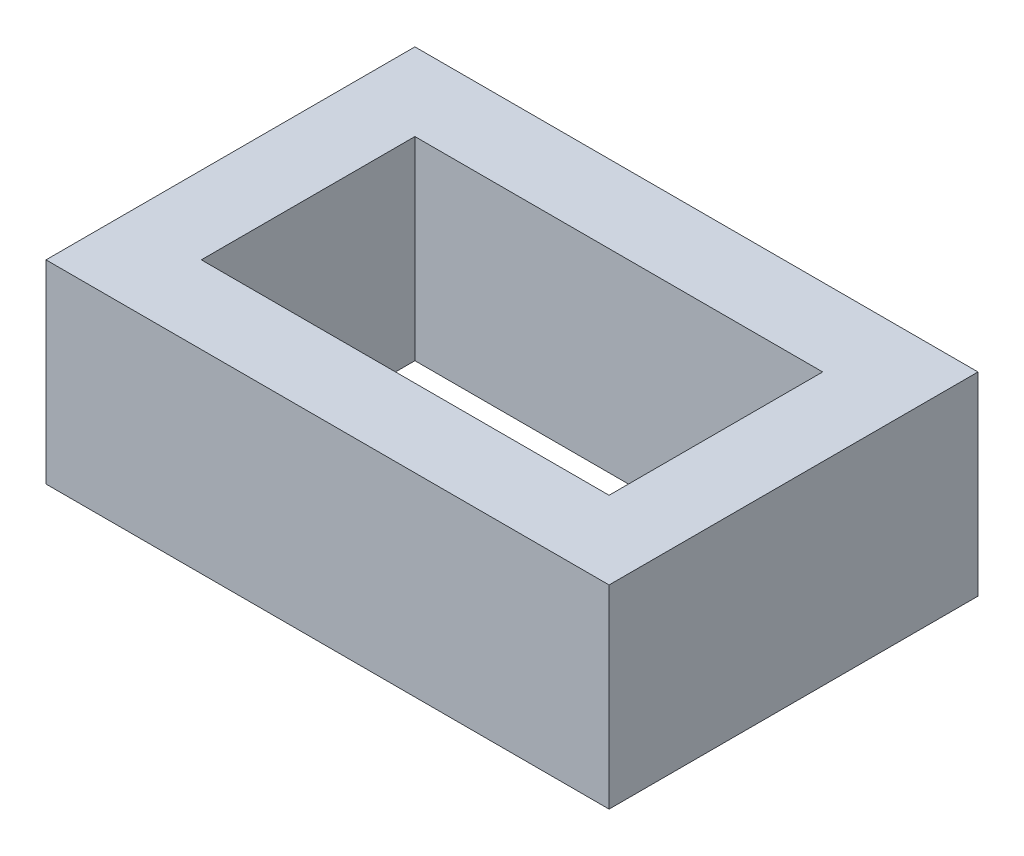
ISO-10303-21;
HEADER;
FILE_DESCRIPTION(('STEP AP214'),'2;1');
FILE_NAME('part.step','',(''),(''),'','','');
FILE_SCHEMA(('AUTOMOTIVE_DESIGN { 1 0 10303 214 1 1 1 1 }'));
ENDSEC;
DATA;
#1=APPLICATION_CONTEXT('core data for automotive mechanical design processes');
#2=APPLICATION_PROTOCOL_DEFINITION('international standard','automotive_design',2000,#1);
#3=PRODUCT_CONTEXT('',#1,'mechanical');
#4=PRODUCT('Part','Part','',(#3));
#5=PRODUCT_RELATED_PRODUCT_CATEGORY('part','',(#4));
#6=PRODUCT_DEFINITION_FORMATION('','',#4);
#7=PRODUCT_DEFINITION_CONTEXT('part definition',#1,'design');
#8=PRODUCT_DEFINITION('design','',#6,#7);
#9=PRODUCT_DEFINITION_SHAPE('','',#8);
#10=(LENGTH_UNIT() NAMED_UNIT(*) SI_UNIT(.MILLI.,.METRE.));
#11=(NAMED_UNIT(*) PLANE_ANGLE_UNIT() SI_UNIT($,.RADIAN.));
#12=(NAMED_UNIT(*) SI_UNIT($,.STERADIAN.) SOLID_ANGLE_UNIT());
#13=UNCERTAINTY_MEASURE_WITH_UNIT(LENGTH_MEASURE(1.E-05),#10,'distance_accuracy_value','');
#14=(GEOMETRIC_REPRESENTATION_CONTEXT(3) GLOBAL_UNCERTAINTY_ASSIGNED_CONTEXT((#13)) GLOBAL_UNIT_ASSIGNED_CONTEXT((#10,
#11,#12)) REPRESENTATION_CONTEXT('',''));
#15=CARTESIAN_POINT('',(0.,0.,0.));
#16=DIRECTION('',(0.,0.,1.));
#17=DIRECTION('',(1.,0.,0.));
#18=AXIS2_PLACEMENT_3D('',#15,#16,#17);
#19=CARTESIAN_POINT('',(0.,5.,0.));
#20=DIRECTION('',(0.,-1.,0.));
#21=DIRECTION('',(0.,0.,-1.));
#22=AXIS2_PLACEMENT_3D('',#19,#20,#21);
#23=PLANE('',#22);
#24=DIRECTION('',(-1.,0.,0.));
#25=VECTOR('',#24,1.);
#26=CARTESIAN_POINT('',(-7.25000000000001,5.,-4.75));
#27=LINE('',#26,#25);
#28=CARTESIAN_POINT('',(7.25,5.,-4.75));
#29=VERTEX_POINT('',#28);
#30=CARTESIAN_POINT('',(-7.25000000000001,5.,-4.75));
#31=VERTEX_POINT('',#30);
#32=EDGE_CURVE('E134',#29,#31,#27,.T.);
#33=ORIENTED_EDGE('',*,*,#32,.T.);
#34=DIRECTION('',(0.,0.,1.));
#35=VECTOR('',#34,1.);
#36=CARTESIAN_POINT('',(-7.25000000000001,5.,-4.75));
#37=LINE('',#36,#35);
#38=CARTESIAN_POINT('',(-7.25000000000001,5.,4.75));
#39=VERTEX_POINT('',#38);
#40=EDGE_CURVE('E137',#31,#39,#37,.T.);
#41=ORIENTED_EDGE('',*,*,#40,.T.);
#42=DIRECTION('',(1.,0.,0.));
#43=VECTOR('',#42,1.);
#44=CARTESIAN_POINT('',(-7.25000000000001,5.,4.75));
#45=LINE('',#44,#43);
#46=CARTESIAN_POINT('',(7.25,5.,4.75));
#47=VERTEX_POINT('',#46);
#48=EDGE_CURVE('E140',#39,#47,#45,.T.);
#49=ORIENTED_EDGE('',*,*,#48,.T.);
#50=DIRECTION('',(0.,0.,-1.));
#51=VECTOR('',#50,1.);
#52=CARTESIAN_POINT('',(7.25,5.,-4.75));
#53=LINE('',#52,#51);
#54=EDGE_CURVE('E142',#47,#29,#53,.T.);
#55=ORIENTED_EDGE('',*,*,#54,.T.);
#56=EDGE_LOOP('',(#33,#41,#49,#55));
#57=FACE_BOUND('',#56,.T.);
#58=DIRECTION('',(0.,0.,-1.));
#59=VECTOR('',#58,1.);
#60=CARTESIAN_POINT('',(5.25,5.,-2.75));
#61=LINE('',#60,#59);
#62=CARTESIAN_POINT('',(5.25,5.,2.75));
#63=VERTEX_POINT('',#62);
#64=CARTESIAN_POINT('',(5.25,5.,-2.75));
#65=VERTEX_POINT('',#64);
#66=EDGE_CURVE('E98',#63,#65,#61,.T.);
#67=ORIENTED_EDGE('',*,*,#66,.F.);
#68=DIRECTION('',(1.,0.,0.));
#69=VECTOR('',#68,1.);
#70=CARTESIAN_POINT('',(-5.25,5.,2.75));
#71=LINE('',#70,#69);
#72=CARTESIAN_POINT('',(-5.25,5.,2.75));
#73=VERTEX_POINT('',#72);
#74=EDGE_CURVE('E120',#73,#63,#71,.T.);
#75=ORIENTED_EDGE('',*,*,#74,.F.);
#76=DIRECTION('',(0.,0.,1.));
#77=VECTOR('',#76,1.);
#78=CARTESIAN_POINT('',(-5.25000000000001,5.,-2.75));
#79=LINE('',#78,#77);
#80=CARTESIAN_POINT('',(-5.25000000000001,5.,-2.75));
#81=VERTEX_POINT('',#80);
#82=EDGE_CURVE('E118',#81,#73,#79,.T.);
#83=ORIENTED_EDGE('',*,*,#82,.F.);
#84=DIRECTION('',(-1.,0.,0.));
#85=VECTOR('',#84,1.);
#86=CARTESIAN_POINT('',(-5.25000000000001,5.,-2.75));
#87=LINE('',#86,#85);
#88=EDGE_CURVE('E106',#65,#81,#87,.T.);
#89=ORIENTED_EDGE('',*,*,#88,.F.);
#90=EDGE_LOOP('',(#67,#75,#83,#89));
#91=FACE_BOUND('',#90,.T.);
#92=ADVANCED_FACE('F33',(#57,#91),#23,.F.);
#93=CARTESIAN_POINT('',(0.,0.,0.));
#94=DIRECTION('',(0.,-1.,0.));
#95=DIRECTION('',(0.,0.,-1.));
#96=AXIS2_PLACEMENT_3D('',#93,#94,#95);
#97=PLANE('',#96);
#98=DIRECTION('',(-1.,0.,0.));
#99=VECTOR('',#98,1.);
#100=CARTESIAN_POINT('',(-7.25000000000001,0.,-4.75));
#101=LINE('',#100,#99);
#102=CARTESIAN_POINT('',(7.25,0.,-4.75));
#103=VERTEX_POINT('',#102);
#104=CARTESIAN_POINT('',(-7.25000000000001,0.,-4.75));
#105=VERTEX_POINT('',#104);
#106=EDGE_CURVE('E114',#103,#105,#101,.T.);
#107=ORIENTED_EDGE('',*,*,#106,.F.);
#108=DIRECTION('',(0.,0.,-1.));
#109=VECTOR('',#108,1.);
#110=CARTESIAN_POINT('',(7.25,0.,-4.75));
#111=LINE('',#110,#109);
#112=CARTESIAN_POINT('',(7.25,0.,4.75));
#113=VERTEX_POINT('',#112);
#114=EDGE_CURVE('E138',#113,#103,#111,.T.);
#115=ORIENTED_EDGE('',*,*,#114,.F.);
#116=DIRECTION('',(1.,0.,0.));
#117=VECTOR('',#116,1.);
#118=CARTESIAN_POINT('',(-7.25000000000001,0.,4.75));
#119=LINE('',#118,#117);
#120=CARTESIAN_POINT('',(-7.25000000000001,0.,4.75));
#121=VERTEX_POINT('',#120);
#122=EDGE_CURVE('E149',#121,#113,#119,.T.);
#123=ORIENTED_EDGE('',*,*,#122,.F.);
#124=DIRECTION('',(0.,0.,1.));
#125=VECTOR('',#124,1.);
#126=CARTESIAN_POINT('',(-7.25000000000001,0.,-4.75));
#127=LINE('',#126,#125);
#128=EDGE_CURVE('E147',#105,#121,#127,.T.);
#129=ORIENTED_EDGE('',*,*,#128,.F.);
#130=EDGE_LOOP('',(#107,#115,#123,#129));
#131=FACE_BOUND('',#130,.T.);
#132=DIRECTION('',(1.,0.,0.));
#133=VECTOR('',#132,1.);
#134=CARTESIAN_POINT('',(-5.25,0.,2.75));
#135=LINE('',#134,#133);
#136=CARTESIAN_POINT('',(-5.25,0.,2.75));
#137=VERTEX_POINT('',#136);
#138=CARTESIAN_POINT('',(5.25,0.,2.75));
#139=VERTEX_POINT('',#138);
#140=EDGE_CURVE('E107',#137,#139,#135,.T.);
#141=ORIENTED_EDGE('',*,*,#140,.T.);
#142=DIRECTION('',(0.,0.,-1.));
#143=VECTOR('',#142,1.);
#144=CARTESIAN_POINT('',(5.25,0.,-2.75));
#145=LINE('',#144,#143);
#146=CARTESIAN_POINT('',(5.25,0.,-2.75));
#147=VERTEX_POINT('',#146);
#148=EDGE_CURVE('E56',#139,#147,#145,.T.);
#149=ORIENTED_EDGE('',*,*,#148,.T.);
#150=DIRECTION('',(-1.,0.,0.));
#151=VECTOR('',#150,1.);
#152=CARTESIAN_POINT('',(-5.25000000000001,0.,-2.75));
#153=LINE('',#152,#151);
#154=CARTESIAN_POINT('',(-5.25000000000001,0.,-2.75));
#155=VERTEX_POINT('',#154);
#156=EDGE_CURVE('E113',#147,#155,#153,.T.);
#157=ORIENTED_EDGE('',*,*,#156,.T.);
#158=DIRECTION('',(0.,0.,1.));
#159=VECTOR('',#158,1.);
#160=CARTESIAN_POINT('',(-5.25000000000001,0.,-2.75));
#161=LINE('',#160,#159);
#162=EDGE_CURVE('E126',#155,#137,#161,.T.);
#163=ORIENTED_EDGE('',*,*,#162,.T.);
#164=EDGE_LOOP('',(#141,#149,#157,#163));
#165=FACE_BOUND('',#164,.T.);
#166=ADVANCED_FACE('F167',(#131,#165),#97,.T.);
#167=CARTESIAN_POINT('',(-7.25000000000001,5.,-4.75));
#168=DIRECTION('',(0.,0.,1.));
#169=DIRECTION('',(1.,0.,0.));
#170=AXIS2_PLACEMENT_3D('',#167,#168,#169);
#171=PLANE('',#170);
#172=ORIENTED_EDGE('',*,*,#106,.T.);
#173=DIRECTION('',(0.,-1.,0.));
#174=VECTOR('',#173,1.);
#175=CARTESIAN_POINT('',(-7.25000000000001,5.,-4.75));
#176=LINE('',#175,#174);
#177=EDGE_CURVE('E11',#31,#105,#176,.T.);
#178=ORIENTED_EDGE('',*,*,#177,.F.);
#179=ORIENTED_EDGE('',*,*,#32,.F.);
#180=DIRECTION('',(0.,-1.,0.));
#181=VECTOR('',#180,1.);
#182=CARTESIAN_POINT('',(7.25,5.,-4.75));
#183=LINE('',#182,#181);
#184=EDGE_CURVE('E144',#29,#103,#183,.T.);
#185=ORIENTED_EDGE('',*,*,#184,.T.);
#186=EDGE_LOOP('',(#172,#178,#179,#185));
#187=FACE_BOUND('',#186,.T.);
#188=ADVANCED_FACE('F35',(#187),#171,.F.);
#189=CARTESIAN_POINT('',(-7.25000000000001,5.,-4.75));
#190=DIRECTION('',(1.,0.,0.));
#191=DIRECTION('',(0.,0.,-1.));
#192=AXIS2_PLACEMENT_3D('',#189,#190,#191);
#193=PLANE('',#192);
#194=ORIENTED_EDGE('',*,*,#128,.T.);
#195=DIRECTION('',(0.,-1.,0.));
#196=VECTOR('',#195,1.);
#197=CARTESIAN_POINT('',(-7.25000000000001,5.,4.75));
#198=LINE('',#197,#196);
#199=EDGE_CURVE('E41',#39,#121,#198,.T.);
#200=ORIENTED_EDGE('',*,*,#199,.F.);
#201=ORIENTED_EDGE('',*,*,#40,.F.);
#202=ORIENTED_EDGE('',*,*,#177,.T.);
#203=EDGE_LOOP('',(#194,#200,#201,#202));
#204=FACE_BOUND('',#203,.T.);
#205=ADVANCED_FACE('F177',(#204),#193,.F.);
#206=CARTESIAN_POINT('',(-7.25000000000001,5.,4.75));
#207=DIRECTION('',(0.,0.,-1.));
#208=DIRECTION('',(-1.,0.,0.));
#209=AXIS2_PLACEMENT_3D('',#206,#207,#208);
#210=PLANE('',#209);
#211=ORIENTED_EDGE('',*,*,#122,.T.);
#212=DIRECTION('',(0.,-1.,0.));
#213=VECTOR('',#212,1.);
#214=CARTESIAN_POINT('',(7.25,5.,4.75));
#215=LINE('',#214,#213);
#216=EDGE_CURVE('E154',#47,#113,#215,.T.);
#217=ORIENTED_EDGE('',*,*,#216,.F.);
#218=ORIENTED_EDGE('',*,*,#48,.F.);
#219=ORIENTED_EDGE('',*,*,#199,.T.);
#220=EDGE_LOOP('',(#211,#217,#218,#219));
#221=FACE_BOUND('',#220,.T.);
#222=ADVANCED_FACE('F161',(#221),#210,.F.);
#223=CARTESIAN_POINT('',(7.25,5.,-4.75));
#224=DIRECTION('',(-1.,0.,0.));
#225=DIRECTION('',(0.,0.,1.));
#226=AXIS2_PLACEMENT_3D('',#223,#224,#225);
#227=PLANE('',#226);
#228=ORIENTED_EDGE('',*,*,#114,.T.);
#229=ORIENTED_EDGE('',*,*,#184,.F.);
#230=ORIENTED_EDGE('',*,*,#54,.F.);
#231=ORIENTED_EDGE('',*,*,#216,.T.);
#232=EDGE_LOOP('',(#228,#229,#230,#231));
#233=FACE_BOUND('',#232,.T.);
#234=ADVANCED_FACE('F171',(#233),#227,.F.);
#235=CARTESIAN_POINT('',(5.25,5.,-2.75));
#236=DIRECTION('',(-1.,0.,0.));
#237=DIRECTION('',(0.,0.,1.));
#238=AXIS2_PLACEMENT_3D('',#235,#236,#237);
#239=PLANE('',#238);
#240=ORIENTED_EDGE('',*,*,#148,.F.);
#241=DIRECTION('',(0.,-1.,0.));
#242=VECTOR('',#241,1.);
#243=CARTESIAN_POINT('',(5.25,5.,2.75));
#244=LINE('',#243,#242);
#245=EDGE_CURVE('E102',#63,#139,#244,.T.);
#246=ORIENTED_EDGE('',*,*,#245,.F.);
#247=ORIENTED_EDGE('',*,*,#66,.T.);
#248=DIRECTION('',(0.,-1.,0.));
#249=VECTOR('',#248,1.);
#250=CARTESIAN_POINT('',(5.25,5.,-2.75));
#251=LINE('',#250,#249);
#252=EDGE_CURVE('E101',#65,#147,#251,.T.);
#253=ORIENTED_EDGE('',*,*,#252,.T.);
#254=EDGE_LOOP('',(#240,#246,#247,#253));
#255=FACE_BOUND('',#254,.T.);
#256=ADVANCED_FACE('F100',(#255),#239,.T.);
#257=CARTESIAN_POINT('',(-5.25000000000001,5.,-2.75));
#258=DIRECTION('',(0.,0.,1.));
#259=DIRECTION('',(1.,0.,0.));
#260=AXIS2_PLACEMENT_3D('',#257,#258,#259);
#261=PLANE('',#260);
#262=ORIENTED_EDGE('',*,*,#156,.F.);
#263=ORIENTED_EDGE('',*,*,#252,.F.);
#264=ORIENTED_EDGE('',*,*,#88,.T.);
#265=DIRECTION('',(0.,-1.,0.));
#266=VECTOR('',#265,1.);
#267=CARTESIAN_POINT('',(-5.25000000000001,5.,-2.75));
#268=LINE('',#267,#266);
#269=EDGE_CURVE('E115',#81,#155,#268,.T.);
#270=ORIENTED_EDGE('',*,*,#269,.T.);
#271=EDGE_LOOP('',(#262,#263,#264,#270));
#272=FACE_BOUND('',#271,.T.);
#273=ADVANCED_FACE('F110',(#272),#261,.T.);
#274=CARTESIAN_POINT('',(-5.25000000000001,5.,-2.75));
#275=DIRECTION('',(1.,0.,0.));
#276=DIRECTION('',(0.,0.,-1.));
#277=AXIS2_PLACEMENT_3D('',#274,#275,#276);
#278=PLANE('',#277);
#279=ORIENTED_EDGE('',*,*,#162,.F.);
#280=ORIENTED_EDGE('',*,*,#269,.F.);
#281=ORIENTED_EDGE('',*,*,#82,.T.);
#282=DIRECTION('',(0.,-1.,0.));
#283=VECTOR('',#282,1.);
#284=CARTESIAN_POINT('',(-5.25,5.,2.75));
#285=LINE('',#284,#283);
#286=EDGE_CURVE('E48',#73,#137,#285,.T.);
#287=ORIENTED_EDGE('',*,*,#286,.T.);
#288=EDGE_LOOP('',(#279,#280,#281,#287));
#289=FACE_BOUND('',#288,.T.);
#290=ADVANCED_FACE('F200',(#289),#278,.T.);
#291=CARTESIAN_POINT('',(-5.25,5.,2.75));
#292=DIRECTION('',(0.,0.,-1.));
#293=DIRECTION('',(-1.,0.,0.));
#294=AXIS2_PLACEMENT_3D('',#291,#292,#293);
#295=PLANE('',#294);
#296=ORIENTED_EDGE('',*,*,#140,.F.);
#297=ORIENTED_EDGE('',*,*,#286,.F.);
#298=ORIENTED_EDGE('',*,*,#74,.T.);
#299=ORIENTED_EDGE('',*,*,#245,.T.);
#300=EDGE_LOOP('',(#296,#297,#298,#299));
#301=FACE_BOUND('',#300,.T.);
#302=ADVANCED_FACE('F204',(#301),#295,.T.);
#303=CLOSED_SHELL('',(#92,#166,#188,#205,#222,#234,#256,#273,#290,#302));
#304=MANIFOLD_SOLID_BREP('B2',#303);
#305=ADVANCED_BREP_SHAPE_REPRESENTATION('',(#18,#304),#14);
#306=SHAPE_DEFINITION_REPRESENTATION(#9,#305);
ENDSEC;
END-ISO-10303-21;
